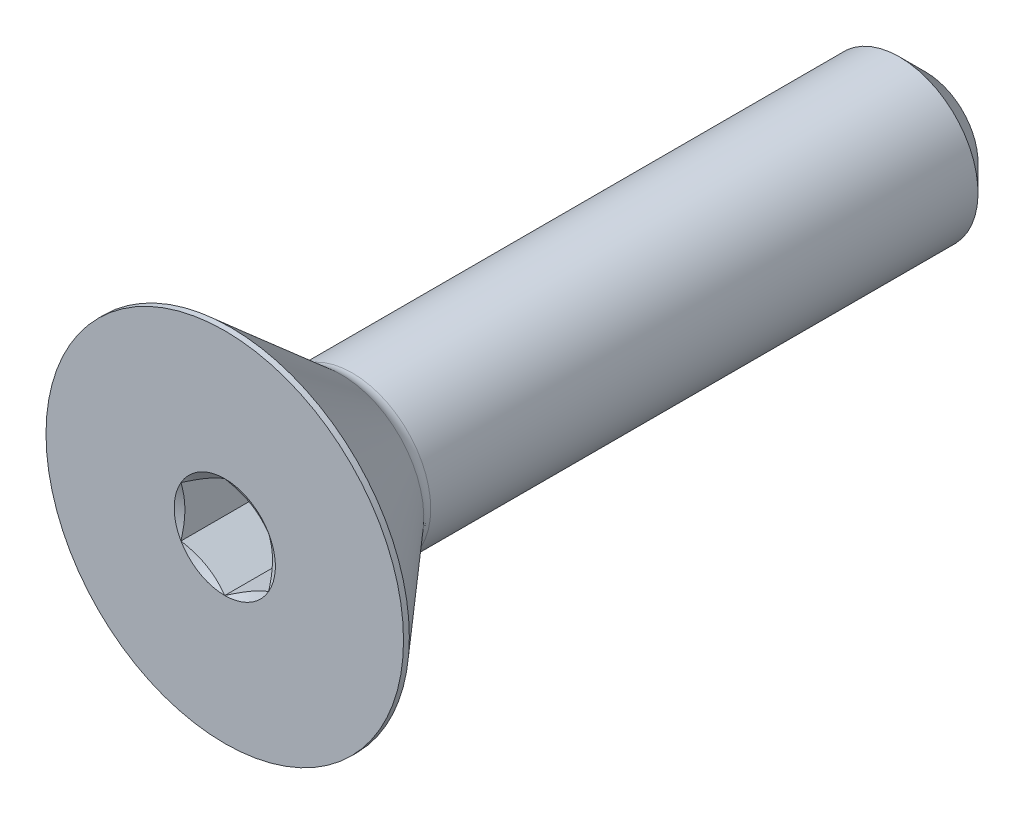
ISO-10303-21;
HEADER;
FILE_DESCRIPTION(('STEP AP214'),'2;1');
FILE_NAME('part.step','',(''),(''),'','','');
FILE_SCHEMA(('AUTOMOTIVE_DESIGN { 1 0 10303 214 1 1 1 1 }'));
ENDSEC;
DATA;
#1=APPLICATION_CONTEXT('core data for automotive mechanical design processes');
#2=APPLICATION_PROTOCOL_DEFINITION('international standard','automotive_design',2000,#1);
#3=PRODUCT_CONTEXT('',#1,'mechanical');
#4=PRODUCT('Part','Part','',(#3));
#5=PRODUCT_RELATED_PRODUCT_CATEGORY('part','',(#4));
#6=PRODUCT_DEFINITION_FORMATION('','',#4);
#7=PRODUCT_DEFINITION_CONTEXT('part definition',#1,'design');
#8=PRODUCT_DEFINITION('design','',#6,#7);
#9=PRODUCT_DEFINITION_SHAPE('','',#8);
#10=(LENGTH_UNIT() NAMED_UNIT(*) SI_UNIT(.MILLI.,.METRE.));
#11=(NAMED_UNIT(*) PLANE_ANGLE_UNIT() SI_UNIT($,.RADIAN.));
#12=(NAMED_UNIT(*) SI_UNIT($,.STERADIAN.) SOLID_ANGLE_UNIT());
#13=UNCERTAINTY_MEASURE_WITH_UNIT(LENGTH_MEASURE(1.E-05),#10,'distance_accuracy_value','');
#14=(GEOMETRIC_REPRESENTATION_CONTEXT(3) GLOBAL_UNCERTAINTY_ASSIGNED_CONTEXT((#13)) GLOBAL_UNIT_ASSIGNED_CONTEXT((#10,
#11,#12)) REPRESENTATION_CONTEXT('',''));
#15=CARTESIAN_POINT('',(0.,0.,0.));
#16=DIRECTION('',(0.,0.,1.));
#17=DIRECTION('',(1.,0.,0.));
#18=AXIS2_PLACEMENT_3D('',#15,#16,#17);
#19=CARTESIAN_POINT('',(0.,0.,-12.7));
#20=DIRECTION('',(0.,0.,-1.));
#21=DIRECTION('',(0.,1.,0.));
#22=AXIS2_PLACEMENT_3D('',#19,#20,#21);
#23=CYLINDRICAL_SURFACE('',#22,1.4224);
#24=CARTESIAN_POINT('',(0.,0.,-12.22375));
#25=DIRECTION('',(0.,0.,-1.));
#26=DIRECTION('',(0.,1.,0.));
#27=AXIS2_PLACEMENT_3D('',#24,#25,#26);
#28=CIRCLE('',#27,1.4224);
#29=CARTESIAN_POINT('',(0.,1.4224,-12.22375));
#30=VERTEX_POINT('',#29);
#31=EDGE_CURVE('E49',#30,#30,#28,.F.);
#32=ORIENTED_EDGE('',*,*,#31,.T.);
#33=EDGE_LOOP('',(#32));
#34=FACE_BOUND('',#33,.T.);
#35=CARTESIAN_POINT('',(0.,0.,-2.30906732217142));
#36=DIRECTION('',(0.,0.,1.));
#37=DIRECTION('',(0.,-1.,0.));
#38=AXIS2_PLACEMENT_3D('',#35,#36,#37);
#39=CIRCLE('',#38,1.4224);
#40=CARTESIAN_POINT('',(0.,-1.4224,-2.30906732217142));
#41=VERTEX_POINT('',#40);
#42=EDGE_CURVE('E208',#41,#41,#39,.T.);
#43=ORIENTED_EDGE('',*,*,#42,.F.);
#44=EDGE_LOOP('',(#43));
#45=FACE_BOUND('',#44,.T.);
#46=ADVANCED_FACE('F36',(#34,#45),#23,.T.);
#47=CARTESIAN_POINT('',(0.,-1.4224,-12.7));
#48=DIRECTION('',(0.,0.,-1.));
#49=DIRECTION('',(0.,1.,0.));
#50=AXIS2_PLACEMENT_3D('',#47,#48,#49);
#51=PLANE('',#50);
#52=CARTESIAN_POINT('',(0.,0.,-12.7));
#53=DIRECTION('',(0.,0.,-1.));
#54=DIRECTION('',(0.,1.,0.));
#55=AXIS2_PLACEMENT_3D('',#52,#53,#54);
#56=CIRCLE('',#55,0.946150000000003);
#57=CARTESIAN_POINT('',(0.,0.946150000000002,-12.7));
#58=VERTEX_POINT('',#57);
#59=EDGE_CURVE('E211',#58,#58,#56,.T.);
#60=ORIENTED_EDGE('',*,*,#59,.T.);
#61=EDGE_LOOP('',(#60));
#62=FACE_BOUND('',#61,.T.);
#63=ADVANCED_FACE('F221',(#62),#51,.T.);
#64=CARTESIAN_POINT('',(0.,0.,-12.7));
#65=DIRECTION('',(0.,0.,1.));
#66=DIRECTION('',(0.,-1.,0.));
#67=AXIS2_PLACEMENT_3D('',#64,#65,#66);
#68=CONICAL_SURFACE('',#67,0.946150000000003,0.785398163397446);
#69=ORIENTED_EDGE('',*,*,#31,.F.);
#70=EDGE_LOOP('',(#69));
#71=FACE_BOUND('',#70,.T.);
#72=ORIENTED_EDGE('',*,*,#59,.F.);
#73=EDGE_LOOP('',(#72));
#74=FACE_BOUND('',#73,.T.);
#75=ADVANCED_FACE('F38',(#71,#74),#68,.T.);
#76=CARTESIAN_POINT('',(0.,0.,-2.30906732217142));
#77=DIRECTION('',(0.,0.,1.));
#78=DIRECTION('',(0.,-1.,0.));
#79=AXIS2_PLACEMENT_3D('',#76,#77,#78);
#80=TOROIDAL_SURFACE('',#79,1.72857263583811,0.306172635838113);
#81=CARTESIAN_POINT('',(0.,0.,-2.1082));
#82=DIRECTION('',(0.,0.,1.));
#83=DIRECTION('',(0.,-1.,0.));
#84=AXIS2_PLACEMENT_3D('',#81,#82,#83);
#85=CIRCLE('',#84,1.49750121436903);
#86=CARTESIAN_POINT('',(0.,-1.49750121436903,-2.1082));
#87=VERTEX_POINT('',#86);
#88=EDGE_CURVE('E205',#87,#87,#85,.T.);
#89=ORIENTED_EDGE('',*,*,#88,.F.);
#90=EDGE_LOOP('',(#89));
#91=FACE_BOUND('',#90,.T.);
#92=ORIENTED_EDGE('',*,*,#42,.T.);
#93=EDGE_LOOP('',(#92));
#94=FACE_BOUND('',#93,.T.);
#95=ADVANCED_FACE('F220',(#91,#94),#80,.F.);
#96=CARTESIAN_POINT('',(0.,0.,-2.1082));
#97=DIRECTION('',(0.,0.,1.));
#98=DIRECTION('',(0.,-1.,0.));
#99=AXIS2_PLACEMENT_3D('',#96,#97,#98);
#100=CONICAL_SURFACE('',#99,1.49750121436903,0.715584993317676);
#101=CARTESIAN_POINT('',(0.,0.,-0.105409999999999));
#102=DIRECTION('',(0.,0.,1.));
#103=DIRECTION('',(0.,-1.,0.));
#104=AXIS2_PLACEMENT_3D('',#101,#102,#103);
#105=CIRCLE('',#104,3.2385);
#106=CARTESIAN_POINT('',(0.,-3.2385,-0.105409999999998));
#107=VERTEX_POINT('',#106);
#108=EDGE_CURVE('E202',#107,#107,#105,.T.);
#109=ORIENTED_EDGE('',*,*,#108,.F.);
#110=EDGE_LOOP('',(#109));
#111=FACE_BOUND('',#110,.T.);
#112=ORIENTED_EDGE('',*,*,#88,.T.);
#113=EDGE_LOOP('',(#112));
#114=FACE_BOUND('',#113,.T.);
#115=ADVANCED_FACE('F233',(#111,#114),#100,.T.);
#116=CARTESIAN_POINT('',(0.,0.,0.));
#117=DIRECTION('',(0.,0.,1.));
#118=DIRECTION('',(0.,-1.,0.));
#119=AXIS2_PLACEMENT_3D('',#116,#117,#118);
#120=CYLINDRICAL_SURFACE('',#119,3.2385);
#121=CARTESIAN_POINT('',(0.,0.,0.));
#122=DIRECTION('',(0.,0.,1.));
#123=DIRECTION('',(0.,-1.,0.));
#124=AXIS2_PLACEMENT_3D('',#121,#122,#123);
#125=CIRCLE('',#124,3.2385);
#126=CARTESIAN_POINT('',(0.,-3.2385,0.));
#127=VERTEX_POINT('',#126);
#128=EDGE_CURVE('E190',#127,#127,#125,.T.);
#129=ORIENTED_EDGE('',*,*,#128,.F.);
#130=EDGE_LOOP('',(#129));
#131=FACE_BOUND('',#130,.T.);
#132=ORIENTED_EDGE('',*,*,#108,.T.);
#133=EDGE_LOOP('',(#132));
#134=FACE_BOUND('',#133,.T.);
#135=ADVANCED_FACE('F165',(#131,#134),#120,.T.);
#136=CARTESIAN_POINT('',(0.,-1.4224,0.));
#137=DIRECTION('',(0.,0.,1.));
#138=DIRECTION('',(0.,-1.,0.));
#139=AXIS2_PLACEMENT_3D('',#136,#137,#138);
#140=PLANE('',#139);
#141=CARTESIAN_POINT('',(0.,0.,0.));
#142=DIRECTION('',(0.,0.,1.));
#143=DIRECTION('',(1.,0.,0.));
#144=AXIS2_PLACEMENT_3D('',#141,#142,#143);
#145=CIRCLE('',#144,0.916543552338531);
#146=CARTESIAN_POINT('',(0.,-0.916543552338531,0.));
#147=VERTEX_POINT('',#146);
#148=CARTESIAN_POINT('',(0.79375,-0.458271776169266,0.));
#149=VERTEX_POINT('',#148);
#150=EDGE_CURVE('E62',#147,#149,#145,.T.);
#151=ORIENTED_EDGE('',*,*,#150,.F.);
#152=CARTESIAN_POINT('',(-0.79375,-0.458271776169266,0.));
#153=VERTEX_POINT('',#152);
#154=EDGE_CURVE('E134',#153,#147,#145,.T.);
#155=ORIENTED_EDGE('',*,*,#154,.F.);
#156=CARTESIAN_POINT('',(-0.79375,0.458271776169267,0.));
#157=VERTEX_POINT('',#156);
#158=EDGE_CURVE('E133',#157,#153,#145,.T.);
#159=ORIENTED_EDGE('',*,*,#158,.F.);
#160=CARTESIAN_POINT('',(0.,0.916543552338531,0.));
#161=VERTEX_POINT('',#160);
#162=EDGE_CURVE('E103',#161,#157,#145,.T.);
#163=ORIENTED_EDGE('',*,*,#162,.F.);
#164=CARTESIAN_POINT('',(0.79375,0.458271776169266,0.));
#165=VERTEX_POINT('',#164);
#166=EDGE_CURVE('E94',#165,#161,#145,.T.);
#167=ORIENTED_EDGE('',*,*,#166,.F.);
#168=EDGE_CURVE('E55',#149,#165,#145,.T.);
#169=ORIENTED_EDGE('',*,*,#168,.F.);
#170=EDGE_LOOP('',(#151,#155,#159,#163,#167,#169));
#171=FACE_BOUND('',#170,.T.);
#172=ORIENTED_EDGE('',*,*,#128,.T.);
#173=EDGE_LOOP('',(#172));
#174=FACE_BOUND('',#173,.T.);
#175=ADVANCED_FACE('F129',(#171,#174),#140,.T.);
#176=CARTESIAN_POINT('',(0.,0.,0.));
#177=DIRECTION('',(0.,0.,1.));
#178=DIRECTION('',(1.,0.,0.));
#179=AXIS2_PLACEMENT_3D('',#176,#177,#178);
#180=CONICAL_SURFACE('',#179,0.916543552338531,1.0471975511966);
#181=ORIENTED_EDGE('',*,*,#162,.T.);
#182=CARTESIAN_POINT('',(0.00019999999999779,0.916659022392368,6.66792635044085E-05));
#183=CARTESIAN_POINT('',(-0.0346838809107507,0.896518804358169,-0.0115690030160382));
#184=CARTESIAN_POINT('',(-0.0698688716948112,0.876204740457557,-0.0221518823475711));
#185=CARTESIAN_POINT('',(-0.140848333034133,0.835224729346365,-0.0406258991675044));
#186=CARTESIAN_POINT('',(-0.176644066385295,0.814558053060232,-0.0485104986405689));
#187=CARTESIAN_POINT('',(-0.247791832929266,0.773480870893829,-0.060786072923882));
#188=CARTESIAN_POINT('',(-0.283132908450754,0.753076691428048,-0.0652587134603383));
#189=CARTESIAN_POINT('',(-0.353981660905662,0.712172145126457,-0.0706016542480099));
#190=CARTESIAN_POINT('',(-0.389489079694737,0.691671927330356,-0.0714763751699731));
#191=CARTESIAN_POINT('',(-0.455857242671569,0.653354250570061,-0.0696730323031939));
#192=CARTESIAN_POINT('',(-0.486727836837865,0.635531104718106,-0.0674377552676918));
#193=CARTESIAN_POINT('',(-0.548267868556957,0.60000095083915,-0.0603481462824388));
#194=CARTESIAN_POINT('',(-0.578937092674119,0.58229406603927,-0.0554913839836967));
#195=CARTESIAN_POINT('',(-0.640604383568039,0.54669043904147,-0.0433478505859996));
#196=CARTESIAN_POINT('',(-0.671594630816905,0.528798211450084,-0.0360095165781085));
#197=CARTESIAN_POINT('',(-0.733112462798852,0.493280874595345,-0.0193536155659443));
#198=CARTESIAN_POINT('',(-0.763640837903604,0.475655309010695,-0.0100399713935465));
#199=CARTESIAN_POINT('',(-0.79395,0.458156306115429,6.66792635048122E-05));
#200=B_SPLINE_CURVE_WITH_KNOTS('',3,(#182,#183,#184,#185,#186,#187,#188,#189,#190,#191,#192,
#193,#194,#195,#196,#197,#198,#199),.UNSPECIFIED.,.F.,.F.,(4,2,2,2,2,2,2,2,4),(0.,
0.125831544450446,0.25196585895368,0.374977197852896,0.497837350672035,0.604884221554417,
0.712030505252138,0.82155593581983,0.9308658596212),.UNSPECIFIED.);
#201=EDGE_CURVE('E11',#161,#157,#200,.T.);
#202=ORIENTED_EDGE('',*,*,#201,.F.);
#203=EDGE_LOOP('',(#181,#202));
#204=FACE_BOUND('',#203,.T.);
#205=ADVANCED_FACE('F107',(#204),#180,.F.);
#206=ORIENTED_EDGE('',*,*,#158,.T.);
#207=CARTESIAN_POINT('',(-0.79375,-1.18677144013803,0.295144260436951));
#208=CARTESIAN_POINT('',(-0.79375,-1.15249425090075,0.278697547687775));
#209=CARTESIAN_POINT('',(-0.79375,-1.1181340538036,0.262424602294776));
#210=CARTESIAN_POINT('',(-0.79375,-1.04920214850666,0.230317225100258));
#211=CARTESIAN_POINT('',(-0.79375,-1.01463040359119,0.214482872216215));
#212=CARTESIAN_POINT('',(-0.79375,-0.910132321746901,0.167596466152912));
#213=CARTESIAN_POINT('',(-0.79375,-0.839832934007452,0.137360442329559));
#214=CARTESIAN_POINT('',(-0.79375,-0.69598619482096,0.0795701196338522));
#215=CARTESIAN_POINT('',(-0.79375,-0.62240195765406,0.0521063854515432));
#216=CARTESIAN_POINT('',(-0.79375,-0.473338323217613,0.00323331967557057));
#217=CARTESIAN_POINT('',(-0.79375,-0.397864413473054,-0.0181917302169989));
#218=CARTESIAN_POINT('',(-0.79375,-0.283130614252097,-0.043040482533594));
#219=CARTESIAN_POINT('',(-0.79375,-0.244668804528152,-0.0501053905263922));
#220=CARTESIAN_POINT('',(-0.79375,-0.167313666138629,-0.0613231947898511));
#221=CARTESIAN_POINT('',(-0.79375,-0.128420366814504,-0.0654762878469687));
#222=CARTESIAN_POINT('',(-0.79375,-0.050884176428459,-0.0704858088444576));
#223=CARTESIAN_POINT('',(-0.79375,-0.012243868521779,-0.0713811397722956));
#224=CARTESIAN_POINT('',(-0.79375,0.0649726891251604,-0.0699031984714606));
#225=CARTESIAN_POINT('',(-0.79375,0.103548934750818,-0.0675297238488714));
#226=CARTESIAN_POINT('',(-0.79375,0.198730861340208,-0.0578498321699578));
#227=CARTESIAN_POINT('',(-0.79375,0.255152459971144,-0.0487294548532528));
#228=CARTESIAN_POINT('',(-0.79375,0.366894297671524,-0.0252092484480372));
#229=CARTESIAN_POINT('',(-0.79375,0.422213124261016,-0.010803056349918));
#230=CARTESIAN_POINT('',(-0.79375,0.532936233543622,0.0221215917250337));
#231=CARTESIAN_POINT('',(-0.79375,0.588314583643671,0.0407250642765896));
#232=CARTESIAN_POINT('',(-0.79375,0.698054165229921,0.0806168122501442));
#233=CARTESIAN_POINT('',(-0.79375,0.752415746100401,0.101904145225199));
#234=CARTESIAN_POINT('',(-0.79375,0.890702967537974,0.158792897151273));
#235=CARTESIAN_POINT('',(-0.79375,0.974079171116096,0.195716983704632));
#236=CARTESIAN_POINT('',(-0.79375,1.13963521546853,0.272159013805735));
#237=CARTESIAN_POINT('',(-0.79375,1.22181474269936,0.311677622723024));
#238=CARTESIAN_POINT('',(-0.79375,1.38546612682917,0.392380391906861));
#239=CARTESIAN_POINT('',(-0.79375,1.46693706168936,0.433566414478332));
#240=CARTESIAN_POINT('',(-0.79375,1.62933346530686,0.517001064930776));
#241=CARTESIAN_POINT('',(-0.79375,1.71025891594193,0.559249727896615));
#242=CARTESIAN_POINT('',(-0.79375,1.86409754938322,0.640452226935566));
#243=CARTESIAN_POINT('',(-0.79375,1.93704550606204,0.679340325650339));
#244=CARTESIAN_POINT('',(-0.79375,2.08270675263586,0.757559427745526));
#245=CARTESIAN_POINT('',(-0.79375,2.15542003371734,0.79689044751696));
#246=CARTESIAN_POINT('',(-0.79375,2.30048109320214,0.875784037308028));
#247=CARTESIAN_POINT('',(-0.79375,2.37282933085058,0.915345763911519));
#248=CARTESIAN_POINT('',(-0.79375,2.51737953625172,0.994726704550177));
#249=CARTESIAN_POINT('',(-0.79375,2.58958151146103,1.03454590500192));
#250=CARTESIAN_POINT('',(-0.793750000000001,2.66173093599242,1.07445949905058));
#251=B_SPLINE_CURVE_WITH_KNOTS('',3,(#207,#208,#209,#210,#211,#212,#213,#214,#215,#216,#217,
#218,#219,#220,#221,#222,#223,#224,#225,#226,#227,#228,#229,#230,#231,#232,#233,#234,#235,#236,
#237,#238,#239,#240,#241,#242,#243,#244,#245,#246,#247,#248,#249,#250),.UNSPECIFIED.,.F.,.F.,(4,
2,2,2,2,2,2,2,2,2,2,2,2,2,2,2,2,2,2,2,2,4),(0.,0.114054209284858,0.228128809154429,
0.457644766080036,0.693149720264092,0.928035886813582,1.04526031446353,1.16247681908113,
1.27828888691804,1.39410812578774,1.56521573206963,1.73652999536154,1.91168813862707,
2.08678494492276,2.3602564973338,2.63379845801325,2.90765485023773,3.18152029619272,
3.42951670917399,3.67752233002695,3.92489713692371,4.17225899796759),.UNSPECIFIED.);
#252=EDGE_CURVE('E102',#157,#153,#251,.F.);
#253=ORIENTED_EDGE('',*,*,#252,.F.);
#254=EDGE_LOOP('',(#206,#253));
#255=FACE_BOUND('',#254,.T.);
#256=ADVANCED_FACE('F261',(#255),#180,.F.);
#257=ORIENTED_EDGE('',*,*,#154,.T.);
#258=CARTESIAN_POINT('',(-0.79395,-0.458156306115428,6.66792635046711E-05));
#259=CARTESIAN_POINT('',(-0.759066119089251,-0.478296524149628,-0.011569003016038));
#260=CARTESIAN_POINT('',(-0.723881128305191,-0.498610588050239,-0.022151882347571));
#261=CARTESIAN_POINT('',(-0.652901666965868,-0.539590599161432,-0.0406258991675044));
#262=CARTESIAN_POINT('',(-0.617105933614707,-0.560257275447564,-0.048510498640569));
#263=CARTESIAN_POINT('',(-0.545958167070736,-0.601334457613967,-0.0607860729238823));
#264=CARTESIAN_POINT('',(-0.510617091549248,-0.621738637079749,-0.0652587134603386));
#265=CARTESIAN_POINT('',(-0.43976833909434,-0.662643183381339,-0.0706016542480104));
#266=CARTESIAN_POINT('',(-0.404260920305265,-0.68314340117744,-0.0714763751699737));
#267=CARTESIAN_POINT('',(-0.337892757328433,-0.721461077937735,-0.0696730323031945));
#268=CARTESIAN_POINT('',(-0.307022163162136,-0.73928422378969,-0.0674377552676925));
#269=CARTESIAN_POINT('',(-0.245482131443044,-0.774814377668646,-0.0603481462824395));
#270=CARTESIAN_POINT('',(-0.214812907325882,-0.792521262468526,-0.0554913839836974));
#271=CARTESIAN_POINT('',(-0.153145616431962,-0.828124889466326,-0.0433478505860004));
#272=CARTESIAN_POINT('',(-0.122155369183096,-0.846017117057712,-0.0360095165781092));
#273=CARTESIAN_POINT('',(-0.0606375372011479,-0.881534453912452,-0.019353615565945));
#274=CARTESIAN_POINT('',(-0.0301091620963965,-0.899160019497102,-0.0100399713935471));
#275=CARTESIAN_POINT('',(0.000199999999999938,-0.916659022392368,6.66792635042485E-05));
#276=B_SPLINE_CURVE_WITH_KNOTS('',3,(#258,#259,#260,#261,#262,#263,#264,#265,#266,#267,#268,
#269,#270,#271,#272,#273,#274,#275),.UNSPECIFIED.,.F.,.F.,(4,2,2,2,2,2,2,2,4),(0.,
0.125831544450446,0.25196585895368,0.374977197852896,0.497837350672035,0.604884221554417,
0.712030505252139,0.821555935819831,0.930865859621202),.UNSPECIFIED.);
#277=EDGE_CURVE('E142',#153,#147,#276,.T.);
#278=ORIENTED_EDGE('',*,*,#277,.F.);
#279=EDGE_LOOP('',(#257,#278));
#280=FACE_BOUND('',#279,.T.);
#281=ADVANCED_FACE('F267',(#280),#180,.F.);
#282=ORIENTED_EDGE('',*,*,#150,.T.);
#283=CARTESIAN_POINT('',(-0.000200000000000007,-0.916659022392368,6.66792635042832E-05));
#284=CARTESIAN_POINT('',(0.0346838809107484,-0.896518804358169,-0.0115690030160384));
#285=CARTESIAN_POINT('',(0.0698688716948089,-0.876204740457557,-0.0221518823475713));
#286=CARTESIAN_POINT('',(0.140848333034131,-0.835224729346365,-0.0406258991675046));
#287=CARTESIAN_POINT('',(0.176644066385292,-0.814558053060232,-0.0485104986405691));
#288=CARTESIAN_POINT('',(0.247791832929264,-0.773480870893829,-0.0607860729238823));
#289=CARTESIAN_POINT('',(0.283132908450751,-0.753076691428048,-0.0652587134603387));
#290=CARTESIAN_POINT('',(0.35398166090566,-0.712172145126457,-0.0706016542480104));
#291=CARTESIAN_POINT('',(0.389489079694735,-0.691671927330356,-0.0714763751699737));
#292=CARTESIAN_POINT('',(0.455857242671567,-0.653354250570061,-0.0696730323031945));
#293=CARTESIAN_POINT('',(0.486727836837863,-0.635531104718106,-0.0674377552676924));
#294=CARTESIAN_POINT('',(0.548267868556956,-0.60000095083915,-0.0603481462824393));
#295=CARTESIAN_POINT('',(0.578937092674118,-0.58229406603927,-0.0554913839836972));
#296=CARTESIAN_POINT('',(0.640604383568038,-0.54669043904147,-0.043347850586));
#297=CARTESIAN_POINT('',(0.671594630816904,-0.528798211450084,-0.0360095165781089));
#298=CARTESIAN_POINT('',(0.733112462798852,-0.493280874595344,-0.0193536155659445));
#299=CARTESIAN_POINT('',(0.763640837903604,-0.475655309010694,-0.0100399713935466));
#300=CARTESIAN_POINT('',(0.79395,-0.458156306115428,6.66792635047493E-05));
#301=B_SPLINE_CURVE_WITH_KNOTS('',3,(#283,#284,#285,#286,#287,#288,#289,#290,#291,#292,#293,
#294,#295,#296,#297,#298,#299,#300),.UNSPECIFIED.,.F.,.F.,(4,2,2,2,2,2,2,2,4),(0.,
0.125831544450445,0.25196585895368,0.374977197852896,0.497837350672035,0.604884221554417,
0.712030505252139,0.821555935819832,0.930865859621202),.UNSPECIFIED.);
#302=EDGE_CURVE('E390',#147,#149,#301,.T.);
#303=ORIENTED_EDGE('',*,*,#302,.F.);
#304=EDGE_LOOP('',(#282,#303));
#305=FACE_BOUND('',#304,.T.);
#306=ADVANCED_FACE('F274',(#305),#180,.F.);
#307=ORIENTED_EDGE('',*,*,#168,.T.);
#308=CARTESIAN_POINT('',(0.793750000000001,-1.18677144013803,0.295144260436952));
#309=CARTESIAN_POINT('',(0.793750000000001,-1.15249425090075,0.278697547687776));
#310=CARTESIAN_POINT('',(0.793750000000001,-1.1181340538036,0.262424602294777));
#311=CARTESIAN_POINT('',(0.793750000000001,-1.04920214850666,0.230317225100259));
#312=CARTESIAN_POINT('',(0.79375,-1.01463040359119,0.214482872216215));
#313=CARTESIAN_POINT('',(0.79375,-0.910132321746902,0.167596466152912));
#314=CARTESIAN_POINT('',(0.79375,-0.839832934007453,0.13736044232956));
#315=CARTESIAN_POINT('',(0.79375,-0.69598619482096,0.0795701196338528));
#316=CARTESIAN_POINT('',(0.79375,-0.62240195765406,0.0521063854515438));
#317=CARTESIAN_POINT('',(0.79375,-0.473338323217613,0.00323331967557087));
#318=CARTESIAN_POINT('',(0.79375,-0.397864413473055,-0.0181917302169987));
#319=CARTESIAN_POINT('',(0.79375,-0.283130614252097,-0.0430404825335938));
#320=CARTESIAN_POINT('',(0.79375,-0.244668804528152,-0.050105390526392));
#321=CARTESIAN_POINT('',(0.79375,-0.167313666138629,-0.0613231947898509));
#322=CARTESIAN_POINT('',(0.79375,-0.128420366814504,-0.0654762878469685));
#323=CARTESIAN_POINT('',(0.79375,-0.0508841764284588,-0.0704858088444575));
#324=CARTESIAN_POINT('',(0.79375,-0.0122438685217788,-0.0713811397722956));
#325=CARTESIAN_POINT('',(0.79375,0.0649726891251606,-0.0699031984714605));
#326=CARTESIAN_POINT('',(0.79375,0.103548934750818,-0.0675297238488714));
#327=CARTESIAN_POINT('',(0.79375,0.198730861340208,-0.0578498321699578));
#328=CARTESIAN_POINT('',(0.79375,0.255152459971144,-0.0487294548532529));
#329=CARTESIAN_POINT('',(0.79375,0.366894297671524,-0.0252092484480373));
#330=CARTESIAN_POINT('',(0.79375,0.422213124261016,-0.0108030563499181));
#331=CARTESIAN_POINT('',(0.79375,0.532936233543622,0.0221215917250336));
#332=CARTESIAN_POINT('',(0.79375,0.588314583643671,0.0407250642765894));
#333=CARTESIAN_POINT('',(0.79375,0.698054165229921,0.080616812250144));
#334=CARTESIAN_POINT('',(0.79375,0.752415746100401,0.101904145225198));
#335=CARTESIAN_POINT('',(0.79375,0.890702967537974,0.158792897151273));
#336=CARTESIAN_POINT('',(0.793749999999999,0.974079171116096,0.195716983704632));
#337=CARTESIAN_POINT('',(0.793749999999999,1.13963521546853,0.272159013805735));
#338=CARTESIAN_POINT('',(0.793749999999999,1.22181474269936,0.311677622723023));
#339=CARTESIAN_POINT('',(0.793749999999999,1.38546612682917,0.392380391906861));
#340=CARTESIAN_POINT('',(0.793749999999999,1.46693706168936,0.433566414478331));
#341=CARTESIAN_POINT('',(0.793749999999999,1.62933346530686,0.517001064930775));
#342=CARTESIAN_POINT('',(0.793749999999999,1.71025891594192,0.559249727896614));
#343=CARTESIAN_POINT('',(0.793749999999999,1.86409754938322,0.640452226935565));
#344=CARTESIAN_POINT('',(0.793749999999999,1.93704550606204,0.679340325650338));
#345=CARTESIAN_POINT('',(0.793749999999999,2.08270675263586,0.757559427745525));
#346=CARTESIAN_POINT('',(0.793749999999999,2.15542003371734,0.796890447516959));
#347=CARTESIAN_POINT('',(0.793749999999999,2.30048109320214,0.875784037308027));
#348=CARTESIAN_POINT('',(0.793749999999999,2.37282933085058,0.915345763911518));
#349=CARTESIAN_POINT('',(0.793749999999999,2.51737953625172,0.994726704550175));
#350=CARTESIAN_POINT('',(0.793749999999999,2.58958151146102,1.03454590500192));
#351=CARTESIAN_POINT('',(0.793749999999999,2.66173093599242,1.07445949905058));
#352=B_SPLINE_CURVE_WITH_KNOTS('',3,(#308,#309,#310,#311,#312,#313,#314,#315,#316,#317,#318,
#319,#320,#321,#322,#323,#324,#325,#326,#327,#328,#329,#330,#331,#332,#333,#334,#335,#336,#337,
#338,#339,#340,#341,#342,#343,#344,#345,#346,#347,#348,#349,#350,#351),.UNSPECIFIED.,.F.,.F.,(4,
2,2,2,2,2,2,2,2,2,2,2,2,2,2,2,2,2,2,2,2,4),(0.,0.114054209284858,0.228128809154428,
0.457644766080036,0.693149720264092,0.928035886813583,1.04526031446353,1.16247681908113,
1.27828888691804,1.39410812578774,1.56521573206963,1.73652999536154,1.91168813862707,
2.08678494492276,2.36025649733381,2.63379845801325,2.90765485023773,3.18152029619272,
3.42951670917399,3.67752233002695,3.92489713692371,4.17225899796758),.UNSPECIFIED.);
#353=EDGE_CURVE('E119',#149,#165,#352,.T.);
#354=ORIENTED_EDGE('',*,*,#353,.F.);
#355=EDGE_LOOP('',(#307,#354));
#356=FACE_BOUND('',#355,.T.);
#357=ADVANCED_FACE('F281',(#356),#180,.F.);
#358=ORIENTED_EDGE('',*,*,#166,.T.);
#359=CARTESIAN_POINT('',(0.79395,0.458156306115427,6.66792635042957E-05));
#360=CARTESIAN_POINT('',(0.759066119089251,0.478296524149626,-0.0115690030160385));
#361=CARTESIAN_POINT('',(0.723881128305191,0.498610588050238,-0.0221518823475714));
#362=CARTESIAN_POINT('',(0.652901666965868,0.53959059916143,-0.0406258991675049));
#363=CARTESIAN_POINT('',(0.617105933614707,0.560257275447563,-0.0485104986405694));
#364=CARTESIAN_POINT('',(0.545958167070736,0.601334457613966,-0.0607860729238827));
#365=CARTESIAN_POINT('',(0.510617091549249,0.621738637079747,-0.0652587134603391));
#366=CARTESIAN_POINT('',(0.43976833909434,0.662643183381338,-0.0706016542480109));
#367=CARTESIAN_POINT('',(0.404260920305265,0.683143401177439,-0.0714763751699742));
#368=CARTESIAN_POINT('',(0.337892757328433,0.721461077937734,-0.0696730323031951));
#369=CARTESIAN_POINT('',(0.307022163162136,0.739284223789689,-0.0674377552676931));
#370=CARTESIAN_POINT('',(0.245482131443043,0.774814377668645,-0.0603481462824401));
#371=CARTESIAN_POINT('',(0.214812907325881,0.792521262468526,-0.0554913839836979));
#372=CARTESIAN_POINT('',(0.153145616431961,0.828124889466326,-0.0433478505860007));
#373=CARTESIAN_POINT('',(0.122155369183094,0.846017117057712,-0.0360095165781095));
#374=CARTESIAN_POINT('',(0.060637537201146,0.881534453912452,-0.0193536155659451));
#375=CARTESIAN_POINT('',(0.0301091620963943,0.899160019497102,-0.0100399713935471));
#376=CARTESIAN_POINT('',(-0.000200000000002309,0.916659022392368,6.66792635044094E-05));
#377=B_SPLINE_CURVE_WITH_KNOTS('',3,(#359,#360,#361,#362,#363,#364,#365,#366,#367,#368,#369,
#370,#371,#372,#373,#374,#375,#376),.UNSPECIFIED.,.F.,.F.,(4,2,2,2,2,2,2,2,4),(0.,
0.125831544450446,0.25196585895368,0.374977197852896,0.497837350672035,0.604884221554418,
0.71203050525214,0.821555935819833,0.930865859621205),.UNSPECIFIED.);
#378=EDGE_CURVE('E98',#165,#161,#377,.T.);
#379=ORIENTED_EDGE('',*,*,#378,.F.);
#380=EDGE_LOOP('',(#358,#379));
#381=FACE_BOUND('',#380,.T.);
#382=ADVANCED_FACE('F96',(#381),#180,.F.);
#383=CARTESIAN_POINT('',(0.,0.91654355233853,-1.47574));
#384=DIRECTION('',(0.,0.,1.));
#385=DIRECTION('',(1.,0.,0.));
#386=AXIS2_PLACEMENT_3D('',#383,#384,#385);
#387=PLANE('',#386);
#388=DIRECTION('',(-0.866025403784439,0.499999999999999,0.));
#389=VECTOR('',#388,1.);
#390=CARTESIAN_POINT('',(0.79375,0.458271776169265,-1.47574));
#391=LINE('',#390,#389);
#392=CARTESIAN_POINT('',(0.79375,0.458271776169265,-1.47574));
#393=VERTEX_POINT('',#392);
#394=CARTESIAN_POINT('',(0.,0.91654355233853,-1.47574));
#395=VERTEX_POINT('',#394);
#396=EDGE_CURVE('E118',#393,#395,#391,.T.);
#397=ORIENTED_EDGE('',*,*,#396,.T.);
#398=DIRECTION('',(-0.866025403784439,-0.5,0.));
#399=VECTOR('',#398,1.);
#400=CARTESIAN_POINT('',(0.,0.91654355233853,-1.47574));
#401=LINE('',#400,#399);
#402=CARTESIAN_POINT('',(-0.79375,0.458271776169266,-1.47574));
#403=VERTEX_POINT('',#402);
#404=EDGE_CURVE('E123',#395,#403,#401,.T.);
#405=ORIENTED_EDGE('',*,*,#404,.T.);
#406=DIRECTION('',(0.,-1.,0.));
#407=VECTOR('',#406,1.);
#408=CARTESIAN_POINT('',(-0.79375,0.458271776169266,-1.47574));
#409=LINE('',#408,#407);
#410=CARTESIAN_POINT('',(-0.79375,-0.458271776169266,-1.47574));
#411=VERTEX_POINT('',#410);
#412=EDGE_CURVE('E178',#403,#411,#409,.T.);
#413=ORIENTED_EDGE('',*,*,#412,.T.);
#414=DIRECTION('',(0.866025403784439,-0.499999999999999,0.));
#415=VECTOR('',#414,1.);
#416=CARTESIAN_POINT('',(-0.79375,-0.458271776169266,-1.47574));
#417=LINE('',#416,#415);
#418=CARTESIAN_POINT('',(0.,-0.91654355233853,-1.47574));
#419=VERTEX_POINT('',#418);
#420=EDGE_CURVE('E181',#411,#419,#417,.T.);
#421=ORIENTED_EDGE('',*,*,#420,.T.);
#422=DIRECTION('',(0.866025403784439,0.499999999999999,0.));
#423=VECTOR('',#422,1.);
#424=CARTESIAN_POINT('',(0.,-0.91654355233853,-1.47574));
#425=LINE('',#424,#423);
#426=CARTESIAN_POINT('',(0.79375,-0.458271776169266,-1.47574));
#427=VERTEX_POINT('',#426);
#428=EDGE_CURVE('E184',#419,#427,#425,.T.);
#429=ORIENTED_EDGE('',*,*,#428,.T.);
#430=DIRECTION('',(0.,1.,0.));
#431=VECTOR('',#430,1.);
#432=CARTESIAN_POINT('',(0.79375,-0.458271776169266,-1.47574));
#433=LINE('',#432,#431);
#434=EDGE_CURVE('E126',#427,#393,#433,.T.);
#435=ORIENTED_EDGE('',*,*,#434,.T.);
#436=EDGE_LOOP('',(#397,#405,#413,#421,#429,#435));
#437=FACE_BOUND('',#436,.T.);
#438=ADVANCED_FACE('F160',(#437),#387,.T.);
#439=CARTESIAN_POINT('',(0.,0.91654355233853,-1.47574));
#440=DIRECTION('',(-0.5,0.866025403784439,0.));
#441=DIRECTION('',(-0.866025403784439,-0.5,0.));
#442=AXIS2_PLACEMENT_3D('',#439,#440,#441);
#443=PLANE('',#442);
#444=DIRECTION('',(0.,0.,1.));
#445=VECTOR('',#444,1.);
#446=CARTESIAN_POINT('',(0.,0.91654355233853,-1.47574));
#447=LINE('',#446,#445);
#448=EDGE_CURVE('E115',#395,#161,#447,.T.);
#449=ORIENTED_EDGE('',*,*,#448,.T.);
#450=ORIENTED_EDGE('',*,*,#201,.T.);
#451=DIRECTION('',(0.,0.,1.));
#452=VECTOR('',#451,1.);
#453=CARTESIAN_POINT('',(-0.79375,0.458271776169266,-1.47574));
#454=LINE('',#453,#452);
#455=EDGE_CURVE('E125',#403,#157,#454,.T.);
#456=ORIENTED_EDGE('',*,*,#455,.F.);
#457=ORIENTED_EDGE('',*,*,#404,.F.);
#458=EDGE_LOOP('',(#449,#450,#456,#457));
#459=FACE_BOUND('',#458,.T.);
#460=ADVANCED_FACE('F121',(#459),#443,.F.);
#461=CARTESIAN_POINT('',(-0.79375,0.458271776169266,-1.47574));
#462=DIRECTION('',(-1.,0.,0.));
#463=DIRECTION('',(0.,-1.,0.));
#464=AXIS2_PLACEMENT_3D('',#461,#462,#463);
#465=PLANE('',#464);
#466=ORIENTED_EDGE('',*,*,#455,.T.);
#467=ORIENTED_EDGE('',*,*,#252,.T.);
#468=DIRECTION('',(0.,0.,1.));
#469=VECTOR('',#468,1.);
#470=CARTESIAN_POINT('',(-0.79375,-0.458271776169266,-1.47574));
#471=LINE('',#470,#469);
#472=EDGE_CURVE('E197',#411,#153,#471,.T.);
#473=ORIENTED_EDGE('',*,*,#472,.F.);
#474=ORIENTED_EDGE('',*,*,#412,.F.);
#475=EDGE_LOOP('',(#466,#467,#473,#474));
#476=FACE_BOUND('',#475,.T.);
#477=ADVANCED_FACE('F150',(#476),#465,.F.);
#478=CARTESIAN_POINT('',(-0.79375,-0.458271776169266,-1.47574));
#479=DIRECTION('',(-0.499999999999999,-0.866025403784439,0.));
#480=DIRECTION('',(0.866025403784439,-0.499999999999999,0.));
#481=AXIS2_PLACEMENT_3D('',#478,#479,#480);
#482=PLANE('',#481);
#483=ORIENTED_EDGE('',*,*,#472,.T.);
#484=ORIENTED_EDGE('',*,*,#277,.T.);
#485=DIRECTION('',(0.,0.,1.));
#486=VECTOR('',#485,1.);
#487=CARTESIAN_POINT('',(0.,-0.91654355233853,-1.47574));
#488=LINE('',#487,#486);
#489=EDGE_CURVE('E194',#419,#147,#488,.T.);
#490=ORIENTED_EDGE('',*,*,#489,.F.);
#491=ORIENTED_EDGE('',*,*,#420,.F.);
#492=EDGE_LOOP('',(#483,#484,#490,#491));
#493=FACE_BOUND('',#492,.T.);
#494=ADVANCED_FACE('F153',(#493),#482,.F.);
#495=CARTESIAN_POINT('',(0.,-0.91654355233853,-1.47574));
#496=DIRECTION('',(0.499999999999999,-0.866025403784439,0.));
#497=DIRECTION('',(0.866025403784439,0.499999999999999,0.));
#498=AXIS2_PLACEMENT_3D('',#495,#496,#497);
#499=PLANE('',#498);
#500=ORIENTED_EDGE('',*,*,#489,.T.);
#501=ORIENTED_EDGE('',*,*,#302,.T.);
#502=DIRECTION('',(0.,0.,1.));
#503=VECTOR('',#502,1.);
#504=CARTESIAN_POINT('',(0.79375,-0.458271776169266,-1.47574));
#505=LINE('',#504,#503);
#506=EDGE_CURVE('E191',#427,#149,#505,.T.);
#507=ORIENTED_EDGE('',*,*,#506,.F.);
#508=ORIENTED_EDGE('',*,*,#428,.F.);
#509=EDGE_LOOP('',(#500,#501,#507,#508));
#510=FACE_BOUND('',#509,.T.);
#511=ADVANCED_FACE('F310',(#510),#499,.F.);
#512=CARTESIAN_POINT('',(0.79375,-0.458271776169266,-1.47574));
#513=DIRECTION('',(1.,0.,0.));
#514=DIRECTION('',(0.,1.,0.));
#515=AXIS2_PLACEMENT_3D('',#512,#513,#514);
#516=PLANE('',#515);
#517=ORIENTED_EDGE('',*,*,#506,.T.);
#518=ORIENTED_EDGE('',*,*,#353,.T.);
#519=DIRECTION('',(0.,0.,1.));
#520=VECTOR('',#519,1.);
#521=CARTESIAN_POINT('',(0.79375,0.458271776169265,-1.47574));
#522=LINE('',#521,#520);
#523=EDGE_CURVE('E117',#393,#165,#522,.T.);
#524=ORIENTED_EDGE('',*,*,#523,.F.);
#525=ORIENTED_EDGE('',*,*,#434,.F.);
#526=EDGE_LOOP('',(#517,#518,#524,#525));
#527=FACE_BOUND('',#526,.T.);
#528=ADVANCED_FACE('F164',(#527),#516,.F.);
#529=CARTESIAN_POINT('',(0.79375,0.458271776169265,-1.47574));
#530=DIRECTION('',(0.499999999999999,0.866025403784439,0.));
#531=DIRECTION('',(-0.866025403784439,0.499999999999999,0.));
#532=AXIS2_PLACEMENT_3D('',#529,#530,#531);
#533=PLANE('',#532);
#534=ORIENTED_EDGE('',*,*,#523,.T.);
#535=ORIENTED_EDGE('',*,*,#378,.T.);
#536=ORIENTED_EDGE('',*,*,#448,.F.);
#537=ORIENTED_EDGE('',*,*,#396,.F.);
#538=EDGE_LOOP('',(#534,#535,#536,#537));
#539=FACE_BOUND('',#538,.T.);
#540=ADVANCED_FACE('F113',(#539),#533,.F.);
#541=CLOSED_SHELL('',(#46,#63,#75,#95,#115,#135,#175,#205,#256,#281,#306,#357,#382,#438,#460,
#477,#494,#511,#528,#540));
#542=MANIFOLD_SOLID_BREP('B2',#541);
#543=ADVANCED_BREP_SHAPE_REPRESENTATION('',(#18,#542),#14);
#544=SHAPE_DEFINITION_REPRESENTATION(#9,#543);
ENDSEC;
END-ISO-10303-21;
